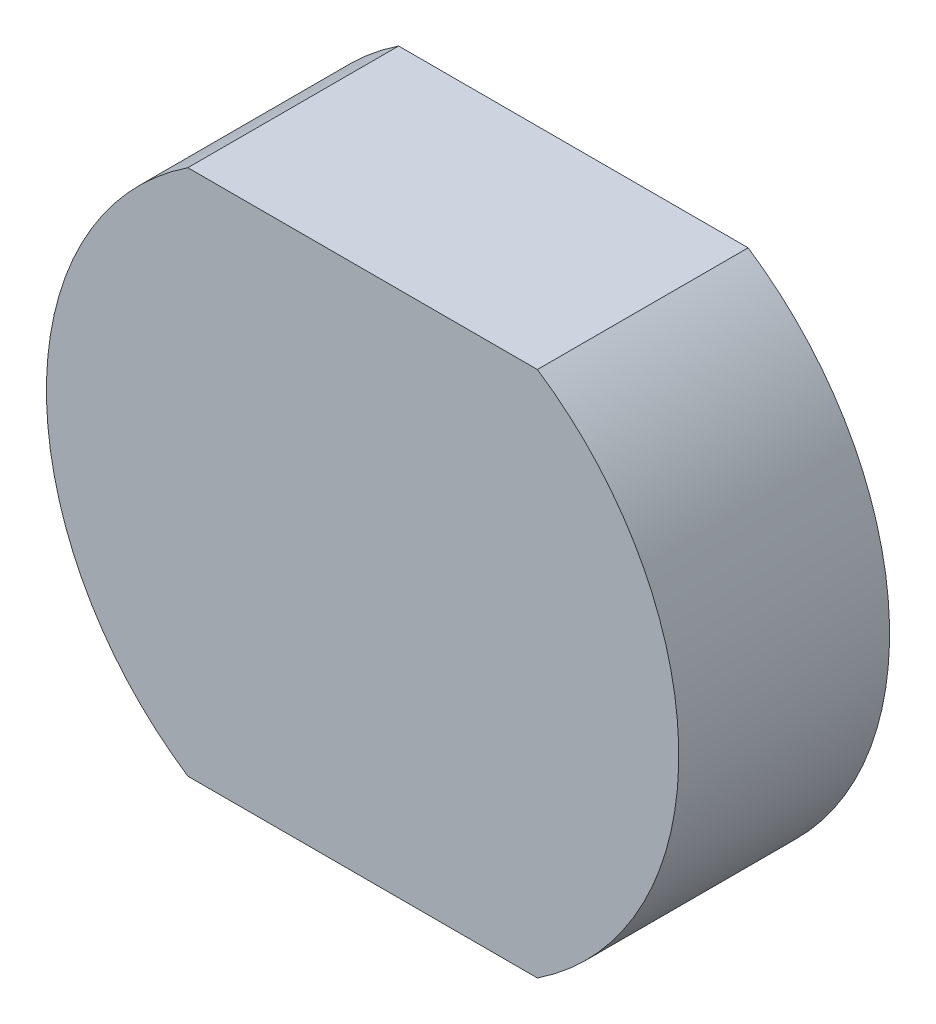
ISO-10303-21;
HEADER;
FILE_DESCRIPTION(('STEP AP214'),'2;1');
FILE_NAME('part.step','',(''),(''),'','','');
FILE_SCHEMA(('AUTOMOTIVE_DESIGN { 1 0 10303 214 1 1 1 1 }'));
ENDSEC;
DATA;
#1=APPLICATION_CONTEXT('core data for automotive mechanical design processes');
#2=APPLICATION_PROTOCOL_DEFINITION('international standard','automotive_design',2000,#1);
#3=PRODUCT_CONTEXT('',#1,'mechanical');
#4=PRODUCT('Part','Part','',(#3));
#5=PRODUCT_RELATED_PRODUCT_CATEGORY('part','',(#4));
#6=PRODUCT_DEFINITION_FORMATION('','',#4);
#7=PRODUCT_DEFINITION_CONTEXT('part definition',#1,'design');
#8=PRODUCT_DEFINITION('design','',#6,#7);
#9=PRODUCT_DEFINITION_SHAPE('','',#8);
#10=(LENGTH_UNIT() NAMED_UNIT(*) SI_UNIT(.MILLI.,.METRE.));
#11=(NAMED_UNIT(*) PLANE_ANGLE_UNIT() SI_UNIT($,.RADIAN.));
#12=(NAMED_UNIT(*) SI_UNIT($,.STERADIAN.) SOLID_ANGLE_UNIT());
#13=UNCERTAINTY_MEASURE_WITH_UNIT(LENGTH_MEASURE(1.E-05),#10,'distance_accuracy_value','');
#14=(GEOMETRIC_REPRESENTATION_CONTEXT(3) GLOBAL_UNCERTAINTY_ASSIGNED_CONTEXT((#13)) GLOBAL_UNIT_ASSIGNED_CONTEXT((#10,
#11,#12)) REPRESENTATION_CONTEXT('',''));
#15=CARTESIAN_POINT('',(0.,0.,0.));
#16=DIRECTION('',(0.,0.,1.));
#17=DIRECTION('',(1.,0.,0.));
#18=AXIS2_PLACEMENT_3D('',#15,#16,#17);
#19=CARTESIAN_POINT('',(0.,0.,10.));
#20=DIRECTION('',(0.,0.,-1.));
#21=DIRECTION('',(-1.,0.,0.));
#22=AXIS2_PLACEMENT_3D('',#19,#20,#21);
#23=CYLINDRICAL_SURFACE('',#22,15.);
#24=CARTESIAN_POINT('',(0.,0.,0.));
#25=DIRECTION('',(0.,0.,1.));
#26=DIRECTION('',(1.,0.,0.));
#27=AXIS2_PLACEMENT_3D('',#24,#25,#26);
#28=CIRCLE('',#27,15.);
#29=CARTESIAN_POINT('',(-8.2915619758885,12.5,0.));
#30=VERTEX_POINT('',#29);
#31=CARTESIAN_POINT('',(-8.2915619758885,-12.5,0.));
#32=VERTEX_POINT('',#31);
#33=EDGE_CURVE('E98',#30,#32,#28,.T.);
#34=ORIENTED_EDGE('',*,*,#33,.T.);
#35=DIRECTION('',(0.,0.,-1.));
#36=VECTOR('',#35,1.);
#37=CARTESIAN_POINT('',(-8.2915619758885,-12.5,10.));
#38=LINE('',#37,#36);
#39=CARTESIAN_POINT('',(-8.2915619758885,-12.5,10.));
#40=VERTEX_POINT('',#39);
#41=EDGE_CURVE('E11',#40,#32,#38,.T.);
#42=ORIENTED_EDGE('',*,*,#41,.F.);
#43=CARTESIAN_POINT('',(0.,0.,10.));
#44=DIRECTION('',(0.,0.,1.));
#45=DIRECTION('',(1.,0.,0.));
#46=AXIS2_PLACEMENT_3D('',#43,#44,#45);
#47=CIRCLE('',#46,15.);
#48=CARTESIAN_POINT('',(-8.2915619758885,12.5,10.));
#49=VERTEX_POINT('',#48);
#50=EDGE_CURVE('E86',#49,#40,#47,.T.);
#51=ORIENTED_EDGE('',*,*,#50,.F.);
#52=DIRECTION('',(0.,0.,-1.));
#53=VECTOR('',#52,1.);
#54=CARTESIAN_POINT('',(-8.2915619758885,12.5,10.));
#55=LINE('',#54,#53);
#56=EDGE_CURVE('E94',#49,#30,#55,.T.);
#57=ORIENTED_EDGE('',*,*,#56,.T.);
#58=EDGE_LOOP('',(#34,#42,#51,#57));
#59=FACE_BOUND('',#58,.T.);
#60=ADVANCED_FACE('F35',(#59),#23,.T.);
#61=CARTESIAN_POINT('',(-8.2915619758885,-12.5,10.));
#62=DIRECTION('',(0.,1.,0.));
#63=DIRECTION('',(0.,0.,1.));
#64=AXIS2_PLACEMENT_3D('',#61,#62,#63);
#65=PLANE('',#64);
#66=DIRECTION('',(1.,0.,0.));
#67=VECTOR('',#66,1.);
#68=CARTESIAN_POINT('',(-8.2915619758885,-12.5,0.));
#69=LINE('',#68,#67);
#70=CARTESIAN_POINT('',(8.2915619758885,-12.5,0.));
#71=VERTEX_POINT('',#70);
#72=EDGE_CURVE('E90',#32,#71,#69,.T.);
#73=ORIENTED_EDGE('',*,*,#72,.T.);
#74=DIRECTION('',(0.,0.,-1.));
#75=VECTOR('',#74,1.);
#76=CARTESIAN_POINT('',(8.2915619758885,-12.5,10.));
#77=LINE('',#76,#75);
#78=CARTESIAN_POINT('',(8.2915619758885,-12.5,10.));
#79=VERTEX_POINT('',#78);
#80=EDGE_CURVE('E43',#79,#71,#77,.T.);
#81=ORIENTED_EDGE('',*,*,#80,.F.);
#82=DIRECTION('',(1.,0.,0.));
#83=VECTOR('',#82,1.);
#84=CARTESIAN_POINT('',(-8.2915619758885,-12.5,10.));
#85=LINE('',#84,#83);
#86=EDGE_CURVE('E81',#40,#79,#85,.T.);
#87=ORIENTED_EDGE('',*,*,#86,.F.);
#88=ORIENTED_EDGE('',*,*,#41,.T.);
#89=EDGE_LOOP('',(#73,#81,#87,#88));
#90=FACE_BOUND('',#89,.T.);
#91=ADVANCED_FACE('F89',(#90),#65,.F.);
#92=CARTESIAN_POINT('',(0.,0.,10.));
#93=DIRECTION('',(0.,0.,-1.));
#94=DIRECTION('',(-1.,0.,0.));
#95=AXIS2_PLACEMENT_3D('',#92,#93,#94);
#96=CYLINDRICAL_SURFACE('',#95,15.);
#97=CARTESIAN_POINT('',(0.,0.,0.));
#98=DIRECTION('',(0.,0.,1.));
#99=DIRECTION('',(1.,0.,0.));
#100=AXIS2_PLACEMENT_3D('',#97,#98,#99);
#101=CIRCLE('',#100,15.);
#102=CARTESIAN_POINT('',(8.2915619758885,12.5,0.));
#103=VERTEX_POINT('',#102);
#104=EDGE_CURVE('E68',#71,#103,#101,.T.);
#105=ORIENTED_EDGE('',*,*,#104,.T.);
#106=DIRECTION('',(0.,0.,-1.));
#107=VECTOR('',#106,1.);
#108=CARTESIAN_POINT('',(8.2915619758885,12.5,10.));
#109=LINE('',#108,#107);
#110=CARTESIAN_POINT('',(8.2915619758885,12.5,10.));
#111=VERTEX_POINT('',#110);
#112=EDGE_CURVE('E91',#111,#103,#109,.T.);
#113=ORIENTED_EDGE('',*,*,#112,.F.);
#114=CARTESIAN_POINT('',(0.,0.,10.));
#115=DIRECTION('',(0.,0.,1.));
#116=DIRECTION('',(1.,0.,0.));
#117=AXIS2_PLACEMENT_3D('',#114,#115,#116);
#118=CIRCLE('',#117,15.);
#119=EDGE_CURVE('E84',#79,#111,#118,.T.);
#120=ORIENTED_EDGE('',*,*,#119,.F.);
#121=ORIENTED_EDGE('',*,*,#80,.T.);
#122=EDGE_LOOP('',(#105,#113,#120,#121));
#123=FACE_BOUND('',#122,.T.);
#124=ADVANCED_FACE('F92',(#123),#96,.T.);
#125=CARTESIAN_POINT('',(-8.2915619758885,12.5,10.));
#126=DIRECTION('',(0.,-1.,0.));
#127=DIRECTION('',(0.,0.,-1.));
#128=AXIS2_PLACEMENT_3D('',#125,#126,#127);
#129=PLANE('',#128);
#130=DIRECTION('',(-1.,0.,0.));
#131=VECTOR('',#130,1.);
#132=CARTESIAN_POINT('',(-8.2915619758885,12.5,0.));
#133=LINE('',#132,#131);
#134=EDGE_CURVE('E74',#103,#30,#133,.T.);
#135=ORIENTED_EDGE('',*,*,#134,.T.);
#136=ORIENTED_EDGE('',*,*,#56,.F.);
#137=DIRECTION('',(-1.,0.,0.));
#138=VECTOR('',#137,1.);
#139=CARTESIAN_POINT('',(-8.2915619758885,12.5,10.));
#140=LINE('',#139,#138);
#141=EDGE_CURVE('E51',#111,#49,#140,.T.);
#142=ORIENTED_EDGE('',*,*,#141,.F.);
#143=ORIENTED_EDGE('',*,*,#112,.T.);
#144=EDGE_LOOP('',(#135,#136,#142,#143));
#145=FACE_BOUND('',#144,.T.);
#146=ADVANCED_FACE('F105',(#145),#129,.F.);
#147=CARTESIAN_POINT('',(0.,0.,10.));
#148=DIRECTION('',(0.,0.,1.));
#149=DIRECTION('',(1.,0.,0.));
#150=AXIS2_PLACEMENT_3D('',#147,#148,#149);
#151=PLANE('',#150);
#152=ORIENTED_EDGE('',*,*,#50,.T.);
#153=ORIENTED_EDGE('',*,*,#86,.T.);
#154=ORIENTED_EDGE('',*,*,#119,.T.);
#155=ORIENTED_EDGE('',*,*,#141,.T.);
#156=EDGE_LOOP('',(#152,#153,#154,#155));
#157=FACE_BOUND('',#156,.T.);
#158=ADVANCED_FACE('F82',(#157),#151,.T.);
#159=CARTESIAN_POINT('',(0.,0.,0.));
#160=DIRECTION('',(0.,0.,1.));
#161=DIRECTION('',(1.,0.,0.));
#162=AXIS2_PLACEMENT_3D('',#159,#160,#161);
#163=PLANE('',#162);
#164=ORIENTED_EDGE('',*,*,#33,.F.);
#165=ORIENTED_EDGE('',*,*,#134,.F.);
#166=ORIENTED_EDGE('',*,*,#104,.F.);
#167=ORIENTED_EDGE('',*,*,#72,.F.);
#168=EDGE_LOOP('',(#164,#165,#166,#167));
#169=FACE_BOUND('',#168,.T.);
#170=ADVANCED_FACE('F108',(#169),#163,.F.);
#171=CLOSED_SHELL('',(#60,#91,#124,#146,#158,#170));
#172=MANIFOLD_SOLID_BREP('B2',#171);
#173=ADVANCED_BREP_SHAPE_REPRESENTATION('',(#18,#172),#14);
#174=SHAPE_DEFINITION_REPRESENTATION(#9,#173);
ENDSEC;
END-ISO-10303-21;
